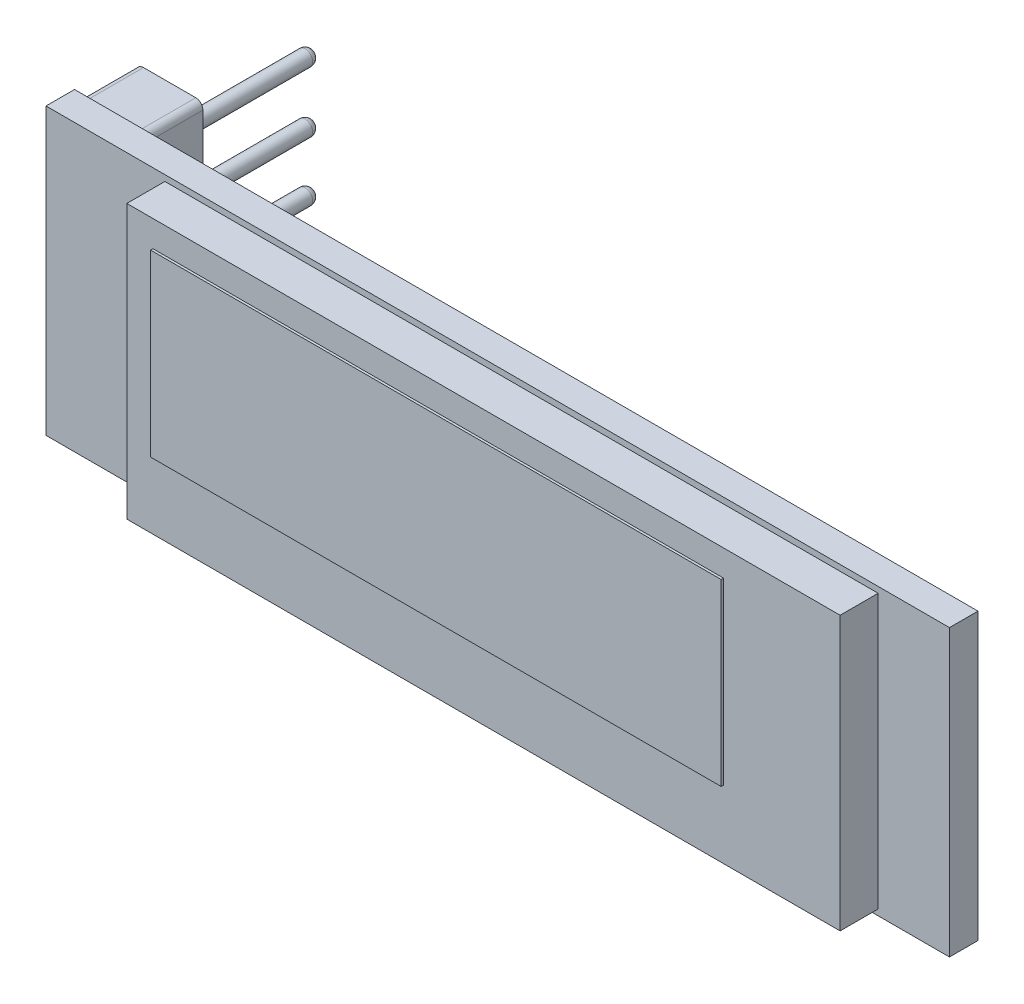
ISO-10303-21;
HEADER;
FILE_DESCRIPTION(('STEP AP214'),'2;1');
FILE_NAME('part.step','',(''),(''),'','','');
FILE_SCHEMA(('AUTOMOTIVE_DESIGN { 1 0 10303 214 1 1 1 1 }'));
ENDSEC;
DATA;
#1=APPLICATION_CONTEXT('core data for automotive mechanical design processes');
#2=APPLICATION_PROTOCOL_DEFINITION('international standard','automotive_design',2000,#1);
#3=PRODUCT_CONTEXT('',#1,'mechanical');
#4=PRODUCT('Part','Part','',(#3));
#5=PRODUCT_RELATED_PRODUCT_CATEGORY('part','',(#4));
#6=PRODUCT_DEFINITION_FORMATION('','',#4);
#7=PRODUCT_DEFINITION_CONTEXT('part definition',#1,'design');
#8=PRODUCT_DEFINITION('design','',#6,#7);
#9=PRODUCT_DEFINITION_SHAPE('','',#8);
#10=(LENGTH_UNIT() NAMED_UNIT(*) SI_UNIT(.MILLI.,.METRE.));
#11=(NAMED_UNIT(*) PLANE_ANGLE_UNIT() SI_UNIT($,.RADIAN.));
#12=(NAMED_UNIT(*) SI_UNIT($,.STERADIAN.) SOLID_ANGLE_UNIT());
#13=UNCERTAINTY_MEASURE_WITH_UNIT(LENGTH_MEASURE(1.E-05),#10,'distance_accuracy_value','');
#14=(GEOMETRIC_REPRESENTATION_CONTEXT(3) GLOBAL_UNCERTAINTY_ASSIGNED_CONTEXT((#13)) GLOBAL_UNIT_ASSIGNED_CONTEXT((#10,
#11,#12)) REPRESENTATION_CONTEXT('',''));
#15=CARTESIAN_POINT('',(0.,0.,0.));
#16=DIRECTION('',(0.,0.,1.));
#17=DIRECTION('',(1.,0.,0.));
#18=AXIS2_PLACEMENT_3D('',#15,#16,#17);
#19=CARTESIAN_POINT('',(0.,0.,2.8));
#20=DIRECTION('',(0.,0.,-1.));
#21=DIRECTION('',(-1.,0.,0.));
#22=AXIS2_PLACEMENT_3D('',#19,#20,#21);
#23=PLANE('',#22);
#24=DIRECTION('',(0.,1.,0.));
#25=VECTOR('',#24,1.);
#26=CARTESIAN_POINT('',(16.,-5.75,2.8));
#27=LINE('',#26,#25);
#28=CARTESIAN_POINT('',(16.,-5.75,2.8));
#29=VERTEX_POINT('',#28);
#30=CARTESIAN_POINT('',(16.,5.75,2.8));
#31=VERTEX_POINT('',#30);
#32=EDGE_CURVE('E227',#29,#31,#27,.T.);
#33=ORIENTED_EDGE('',*,*,#32,.T.);
#34=DIRECTION('',(-1.,0.,0.));
#35=VECTOR('',#34,1.);
#36=CARTESIAN_POINT('',(-14.,5.75,2.8));
#37=LINE('',#36,#35);
#38=CARTESIAN_POINT('',(-14.,5.75,2.8));
#39=VERTEX_POINT('',#38);
#40=EDGE_CURVE('E230',#31,#39,#37,.T.);
#41=ORIENTED_EDGE('',*,*,#40,.T.);
#42=DIRECTION('',(0.,-1.,0.));
#43=VECTOR('',#42,1.);
#44=CARTESIAN_POINT('',(-14.,-5.75,2.8));
#45=LINE('',#44,#43);
#46=CARTESIAN_POINT('',(-14.,-5.75,2.8));
#47=VERTEX_POINT('',#46);
#48=EDGE_CURVE('E233',#39,#47,#45,.T.);
#49=ORIENTED_EDGE('',*,*,#48,.T.);
#50=DIRECTION('',(1.,0.,0.));
#51=VECTOR('',#50,1.);
#52=CARTESIAN_POINT('',(-14.,-5.75,2.8));
#53=LINE('',#52,#51);
#54=EDGE_CURVE('E235',#47,#29,#53,.T.);
#55=ORIENTED_EDGE('',*,*,#54,.T.);
#56=EDGE_LOOP('',(#33,#41,#49,#55));
#57=FACE_BOUND('',#56,.T.);
#58=DIRECTION('',(0.,1.,0.));
#59=VECTOR('',#58,1.);
#60=CARTESIAN_POINT('',(11.1,4.65,2.8));
#61=LINE('',#60,#59);
#62=CARTESIAN_POINT('',(11.1,-2.89,2.8));
#63=VERTEX_POINT('',#62);
#64=CARTESIAN_POINT('',(11.1,4.65,2.8));
#65=VERTEX_POINT('',#64);
#66=EDGE_CURVE('E51',#63,#65,#61,.T.);
#67=ORIENTED_EDGE('',*,*,#66,.F.);
#68=DIRECTION('',(1.,0.,0.));
#69=VECTOR('',#68,1.);
#70=CARTESIAN_POINT('',(-12.9,-2.89,2.8));
#71=LINE('',#70,#69);
#72=CARTESIAN_POINT('',(-12.9,-2.89,2.8));
#73=VERTEX_POINT('',#72);
#74=EDGE_CURVE('E55',#73,#63,#71,.T.);
#75=ORIENTED_EDGE('',*,*,#74,.F.);
#76=DIRECTION('',(0.,-1.,0.));
#77=VECTOR('',#76,1.);
#78=CARTESIAN_POINT('',(-12.9,4.65,2.8));
#79=LINE('',#78,#77);
#80=CARTESIAN_POINT('',(-12.9,4.65,2.8));
#81=VERTEX_POINT('',#80);
#82=EDGE_CURVE('E736',#81,#73,#79,.T.);
#83=ORIENTED_EDGE('',*,*,#82,.F.);
#84=DIRECTION('',(-1.,0.,0.));
#85=VECTOR('',#84,1.);
#86=CARTESIAN_POINT('',(-12.9,4.65,2.8));
#87=LINE('',#86,#85);
#88=EDGE_CURVE('E742',#65,#81,#87,.T.);
#89=ORIENTED_EDGE('',*,*,#88,.F.);
#90=EDGE_LOOP('',(#67,#75,#83,#89));
#91=FACE_BOUND('',#90,.T.);
#92=ADVANCED_FACE('F36',(#57,#91),#23,.F.);
#93=CARTESIAN_POINT('',(0.,0.,0.));
#94=DIRECTION('',(0.,0.,1.));
#95=DIRECTION('',(1.,0.,0.));
#96=AXIS2_PLACEMENT_3D('',#93,#94,#95);
#97=PLANE('',#96);
#98=DIRECTION('',(0.,-1.,0.));
#99=VECTOR('',#98,1.);
#100=CARTESIAN_POINT('',(-19.,-6.,0.));
#101=LINE('',#100,#99);
#102=CARTESIAN_POINT('',(-19.,6.,0.));
#103=VERTEX_POINT('',#102);
#104=CARTESIAN_POINT('',(-19.,-6.,0.));
#105=VERTEX_POINT('',#104);
#106=EDGE_CURVE('E259',#103,#105,#101,.T.);
#107=ORIENTED_EDGE('',*,*,#106,.F.);
#108=DIRECTION('',(-1.,0.,0.));
#109=VECTOR('',#108,1.);
#110=CARTESIAN_POINT('',(19.,6.,0.));
#111=LINE('',#110,#109);
#112=CARTESIAN_POINT('',(19.,6.,0.));
#113=VERTEX_POINT('',#112);
#114=EDGE_CURVE('E264',#113,#103,#111,.T.);
#115=ORIENTED_EDGE('',*,*,#114,.F.);
#116=DIRECTION('',(0.,1.,0.));
#117=VECTOR('',#116,1.);
#118=CARTESIAN_POINT('',(19.,-6.,0.));
#119=LINE('',#118,#117);
#120=CARTESIAN_POINT('',(19.,-6.,0.));
#121=VERTEX_POINT('',#120);
#122=EDGE_CURVE('E275',#121,#113,#119,.T.);
#123=ORIENTED_EDGE('',*,*,#122,.F.);
#124=DIRECTION('',(1.,0.,0.));
#125=VECTOR('',#124,1.);
#126=CARTESIAN_POINT('',(19.,-6.,0.));
#127=LINE('',#126,#125);
#128=EDGE_CURVE('E273',#105,#121,#127,.T.);
#129=ORIENTED_EDGE('',*,*,#128,.F.);
#130=EDGE_LOOP('',(#107,#115,#123,#129));
#131=FACE_BOUND('',#130,.T.);
#132=DIRECTION('',(0.,-1.,0.));
#133=VECTOR('',#132,1.);
#134=CARTESIAN_POINT('',(-16.1,-5.75,0.));
#135=LINE('',#134,#133);
#136=CARTESIAN_POINT('',(-16.1,5.45,0.));
#137=VERTEX_POINT('',#136);
#138=CARTESIAN_POINT('',(-16.1,-5.45,0.));
#139=VERTEX_POINT('',#138);
#140=EDGE_CURVE('E215',#137,#139,#135,.T.);
#141=ORIENTED_EDGE('',*,*,#140,.F.);
#142=CARTESIAN_POINT('',(-16.4,5.45,0.));
#143=DIRECTION('',(0.,0.,1.));
#144=DIRECTION('',(1.,0.,0.));
#145=AXIS2_PLACEMENT_3D('',#142,#143,#144);
#146=CIRCLE('',#145,0.3);
#147=CARTESIAN_POINT('',(-16.4,5.75,0.));
#148=VERTEX_POINT('',#147);
#149=EDGE_CURVE('E348',#137,#148,#146,.T.);
#150=ORIENTED_EDGE('',*,*,#149,.T.);
#151=DIRECTION('',(1.,0.,0.));
#152=VECTOR('',#151,1.);
#153=CARTESIAN_POINT('',(-18.9,5.75,0.));
#154=LINE('',#153,#152);
#155=CARTESIAN_POINT('',(-18.6,5.75,0.));
#156=VERTEX_POINT('',#155);
#157=EDGE_CURVE('E205',#156,#148,#154,.T.);
#158=ORIENTED_EDGE('',*,*,#157,.F.);
#159=CARTESIAN_POINT('',(-18.6,5.45,0.));
#160=DIRECTION('',(0.,0.,1.));
#161=DIRECTION('',(1.,0.,0.));
#162=AXIS2_PLACEMENT_3D('',#159,#160,#161);
#163=CIRCLE('',#162,0.3);
#164=CARTESIAN_POINT('',(-18.9,5.45,0.));
#165=VERTEX_POINT('',#164);
#166=EDGE_CURVE('E350',#156,#165,#163,.T.);
#167=ORIENTED_EDGE('',*,*,#166,.T.);
#168=DIRECTION('',(0.,1.,0.));
#169=VECTOR('',#168,1.);
#170=CARTESIAN_POINT('',(-18.9,-5.75,0.));
#171=LINE('',#170,#169);
#172=CARTESIAN_POINT('',(-18.9,-5.45,0.));
#173=VERTEX_POINT('',#172);
#174=EDGE_CURVE('E222',#173,#165,#171,.T.);
#175=ORIENTED_EDGE('',*,*,#174,.F.);
#176=CARTESIAN_POINT('',(-18.6,-5.45,0.));
#177=DIRECTION('',(0.,0.,1.));
#178=DIRECTION('',(1.,0.,0.));
#179=AXIS2_PLACEMENT_3D('',#176,#177,#178);
#180=CIRCLE('',#179,0.3);
#181=CARTESIAN_POINT('',(-18.6,-5.75,0.));
#182=VERTEX_POINT('',#181);
#183=EDGE_CURVE('E11',#173,#182,#180,.T.);
#184=ORIENTED_EDGE('',*,*,#183,.T.);
#185=DIRECTION('',(-1.,0.,0.));
#186=VECTOR('',#185,1.);
#187=CARTESIAN_POINT('',(-18.9,-5.75,0.));
#188=LINE('',#187,#186);
#189=CARTESIAN_POINT('',(-16.4,-5.75,0.));
#190=VERTEX_POINT('',#189);
#191=EDGE_CURVE('E218',#190,#182,#188,.T.);
#192=ORIENTED_EDGE('',*,*,#191,.F.);
#193=CARTESIAN_POINT('',(-16.4,-5.45,0.));
#194=DIRECTION('',(0.,0.,1.));
#195=DIRECTION('',(1.,0.,0.));
#196=AXIS2_PLACEMENT_3D('',#193,#194,#195);
#197=CIRCLE('',#196,0.3);
#198=EDGE_CURVE('E44',#190,#139,#197,.T.);
#199=ORIENTED_EDGE('',*,*,#198,.T.);
#200=EDGE_LOOP('',(#141,#150,#158,#167,#175,#184,#192,#199));
#201=FACE_BOUND('',#200,.T.);
#202=ADVANCED_FACE('F354',(#131,#201),#97,.F.);
#203=CARTESIAN_POINT('',(-19.,-6.,1.2));
#204=DIRECTION('',(1.,0.,0.));
#205=DIRECTION('',(0.,0.,-1.));
#206=AXIS2_PLACEMENT_3D('',#203,#204,#205);
#207=PLANE('',#206);
#208=ORIENTED_EDGE('',*,*,#106,.T.);
#209=DIRECTION('',(0.,0.,-1.));
#210=VECTOR('',#209,1.);
#211=CARTESIAN_POINT('',(-19.,-6.,1.2));
#212=LINE('',#211,#210);
#213=CARTESIAN_POINT('',(-19.,-6.,1.2));
#214=VERTEX_POINT('',#213);
#215=EDGE_CURVE('E286',#214,#105,#212,.T.);
#216=ORIENTED_EDGE('',*,*,#215,.F.);
#217=DIRECTION('',(0.,-1.,0.));
#218=VECTOR('',#217,1.);
#219=CARTESIAN_POINT('',(-19.,-6.,1.2));
#220=LINE('',#219,#218);
#221=CARTESIAN_POINT('',(-19.,6.,1.2));
#222=VERTEX_POINT('',#221);
#223=EDGE_CURVE('E260',#222,#214,#220,.T.);
#224=ORIENTED_EDGE('',*,*,#223,.F.);
#225=DIRECTION('',(0.,0.,-1.));
#226=VECTOR('',#225,1.);
#227=CARTESIAN_POINT('',(-19.,6.,1.2));
#228=LINE('',#227,#226);
#229=EDGE_CURVE('E270',#222,#103,#228,.T.);
#230=ORIENTED_EDGE('',*,*,#229,.T.);
#231=EDGE_LOOP('',(#208,#216,#224,#230));
#232=FACE_BOUND('',#231,.T.);
#233=ADVANCED_FACE('F407',(#232),#207,.F.);
#234=CARTESIAN_POINT('',(19.,-6.,1.2));
#235=DIRECTION('',(0.,1.,0.));
#236=DIRECTION('',(-1.,0.,0.));
#237=AXIS2_PLACEMENT_3D('',#234,#235,#236);
#238=PLANE('',#237);
#239=ORIENTED_EDGE('',*,*,#128,.T.);
#240=DIRECTION('',(0.,0.,-1.));
#241=VECTOR('',#240,1.);
#242=CARTESIAN_POINT('',(19.,-6.,1.2));
#243=LINE('',#242,#241);
#244=CARTESIAN_POINT('',(19.,-6.,1.2));
#245=VERTEX_POINT('',#244);
#246=EDGE_CURVE('E283',#245,#121,#243,.T.);
#247=ORIENTED_EDGE('',*,*,#246,.F.);
#248=DIRECTION('',(1.,0.,0.));
#249=VECTOR('',#248,1.);
#250=CARTESIAN_POINT('',(19.,-6.,1.2));
#251=LINE('',#250,#249);
#252=EDGE_CURVE('E263',#214,#245,#251,.T.);
#253=ORIENTED_EDGE('',*,*,#252,.F.);
#254=ORIENTED_EDGE('',*,*,#215,.T.);
#255=EDGE_LOOP('',(#239,#247,#253,#254));
#256=FACE_BOUND('',#255,.T.);
#257=ADVANCED_FACE('F440',(#256),#238,.F.);
#258=CARTESIAN_POINT('',(19.,-6.,1.2));
#259=DIRECTION('',(-1.,0.,0.));
#260=DIRECTION('',(0.,0.,1.));
#261=AXIS2_PLACEMENT_3D('',#258,#259,#260);
#262=PLANE('',#261);
#263=ORIENTED_EDGE('',*,*,#122,.T.);
#264=DIRECTION('',(0.,0.,-1.));
#265=VECTOR('',#264,1.);
#266=CARTESIAN_POINT('',(19.,6.,1.2));
#267=LINE('',#266,#265);
#268=CARTESIAN_POINT('',(19.,6.,1.2));
#269=VERTEX_POINT('',#268);
#270=EDGE_CURVE('E280',#269,#113,#267,.T.);
#271=ORIENTED_EDGE('',*,*,#270,.F.);
#272=DIRECTION('',(0.,1.,0.));
#273=VECTOR('',#272,1.);
#274=CARTESIAN_POINT('',(19.,-6.,1.2));
#275=LINE('',#274,#273);
#276=EDGE_CURVE('E266',#245,#269,#275,.T.);
#277=ORIENTED_EDGE('',*,*,#276,.F.);
#278=ORIENTED_EDGE('',*,*,#246,.T.);
#279=EDGE_LOOP('',(#263,#271,#277,#278));
#280=FACE_BOUND('',#279,.T.);
#281=ADVANCED_FACE('F436',(#280),#262,.F.);
#282=CARTESIAN_POINT('',(19.,6.,1.2));
#283=DIRECTION('',(0.,-1.,0.));
#284=DIRECTION('',(1.,0.,0.));
#285=AXIS2_PLACEMENT_3D('',#282,#283,#284);
#286=PLANE('',#285);
#287=ORIENTED_EDGE('',*,*,#114,.T.);
#288=ORIENTED_EDGE('',*,*,#229,.F.);
#289=DIRECTION('',(-1.,0.,0.));
#290=VECTOR('',#289,1.);
#291=CARTESIAN_POINT('',(19.,6.,1.2));
#292=LINE('',#291,#290);
#293=EDGE_CURVE('E268',#269,#222,#292,.T.);
#294=ORIENTED_EDGE('',*,*,#293,.F.);
#295=ORIENTED_EDGE('',*,*,#270,.T.);
#296=EDGE_LOOP('',(#287,#288,#294,#295));
#297=FACE_BOUND('',#296,.T.);
#298=ADVANCED_FACE('F431',(#297),#286,.F.);
#299=CARTESIAN_POINT('',(0.,0.,1.2));
#300=DIRECTION('',(0.,0.,1.));
#301=DIRECTION('',(1.,0.,0.));
#302=AXIS2_PLACEMENT_3D('',#299,#300,#301);
#303=PLANE('',#302);
#304=DIRECTION('',(0.,1.,0.));
#305=VECTOR('',#304,1.);
#306=CARTESIAN_POINT('',(16.,-5.75,1.2));
#307=LINE('',#306,#305);
#308=CARTESIAN_POINT('',(16.,-5.75,1.2));
#309=VERTEX_POINT('',#308);
#310=CARTESIAN_POINT('',(16.,5.75,1.2));
#311=VERTEX_POINT('',#310);
#312=EDGE_CURVE('E214',#309,#311,#307,.T.);
#313=ORIENTED_EDGE('',*,*,#312,.F.);
#314=DIRECTION('',(1.,0.,0.));
#315=VECTOR('',#314,1.);
#316=CARTESIAN_POINT('',(-14.,-5.75,1.2));
#317=LINE('',#316,#315);
#318=CARTESIAN_POINT('',(-14.,-5.75,1.2));
#319=VERTEX_POINT('',#318);
#320=EDGE_CURVE('E231',#319,#309,#317,.T.);
#321=ORIENTED_EDGE('',*,*,#320,.F.);
#322=DIRECTION('',(0.,-1.,0.));
#323=VECTOR('',#322,1.);
#324=CARTESIAN_POINT('',(-14.,-5.75,1.2));
#325=LINE('',#324,#323);
#326=CARTESIAN_POINT('',(-14.,5.75,1.2));
#327=VERTEX_POINT('',#326);
#328=EDGE_CURVE('E243',#327,#319,#325,.T.);
#329=ORIENTED_EDGE('',*,*,#328,.F.);
#330=DIRECTION('',(-1.,0.,0.));
#331=VECTOR('',#330,1.);
#332=CARTESIAN_POINT('',(-14.,5.75,1.2));
#333=LINE('',#332,#331);
#334=EDGE_CURVE('E240',#311,#327,#333,.T.);
#335=ORIENTED_EDGE('',*,*,#334,.F.);
#336=EDGE_LOOP('',(#313,#321,#329,#335));
#337=FACE_BOUND('',#336,.T.);
#338=ORIENTED_EDGE('',*,*,#223,.T.);
#339=ORIENTED_EDGE('',*,*,#252,.T.);
#340=ORIENTED_EDGE('',*,*,#276,.T.);
#341=ORIENTED_EDGE('',*,*,#293,.T.);
#342=EDGE_LOOP('',(#338,#339,#340,#341));
#343=FACE_BOUND('',#342,.T.);
#344=ADVANCED_FACE('F428',(#337,#343),#303,.T.);
#345=CARTESIAN_POINT('',(16.,-5.75,2.8));
#346=DIRECTION('',(-1.,0.,0.));
#347=DIRECTION('',(0.,0.,1.));
#348=AXIS2_PLACEMENT_3D('',#345,#346,#347);
#349=PLANE('',#348);
#350=ORIENTED_EDGE('',*,*,#312,.T.);
#351=DIRECTION('',(0.,0.,-1.));
#352=VECTOR('',#351,1.);
#353=CARTESIAN_POINT('',(16.,5.75,2.8));
#354=LINE('',#353,#352);
#355=EDGE_CURVE('E256',#31,#311,#354,.T.);
#356=ORIENTED_EDGE('',*,*,#355,.F.);
#357=ORIENTED_EDGE('',*,*,#32,.F.);
#358=DIRECTION('',(0.,0.,-1.));
#359=VECTOR('',#358,1.);
#360=CARTESIAN_POINT('',(16.,-5.75,2.8));
#361=LINE('',#360,#359);
#362=EDGE_CURVE('E237',#29,#309,#361,.T.);
#363=ORIENTED_EDGE('',*,*,#362,.T.);
#364=EDGE_LOOP('',(#350,#356,#357,#363));
#365=FACE_BOUND('',#364,.T.);
#366=ADVANCED_FACE('F424',(#365),#349,.F.);
#367=CARTESIAN_POINT('',(-14.,5.75,2.8));
#368=DIRECTION('',(0.,-1.,0.));
#369=DIRECTION('',(0.,0.,-1.));
#370=AXIS2_PLACEMENT_3D('',#367,#368,#369);
#371=PLANE('',#370);
#372=ORIENTED_EDGE('',*,*,#334,.T.);
#373=DIRECTION('',(0.,0.,-1.));
#374=VECTOR('',#373,1.);
#375=CARTESIAN_POINT('',(-14.,5.75,2.8));
#376=LINE('',#375,#374);
#377=EDGE_CURVE('E253',#39,#327,#376,.T.);
#378=ORIENTED_EDGE('',*,*,#377,.F.);
#379=ORIENTED_EDGE('',*,*,#40,.F.);
#380=ORIENTED_EDGE('',*,*,#355,.T.);
#381=EDGE_LOOP('',(#372,#378,#379,#380));
#382=FACE_BOUND('',#381,.T.);
#383=ADVANCED_FACE('F420',(#382),#371,.F.);
#384=CARTESIAN_POINT('',(-14.,-5.75,2.8));
#385=DIRECTION('',(1.,0.,0.));
#386=DIRECTION('',(0.,0.,-1.));
#387=AXIS2_PLACEMENT_3D('',#384,#385,#386);
#388=PLANE('',#387);
#389=ORIENTED_EDGE('',*,*,#328,.T.);
#390=DIRECTION('',(0.,0.,-1.));
#391=VECTOR('',#390,1.);
#392=CARTESIAN_POINT('',(-14.,-5.75,2.8));
#393=LINE('',#392,#391);
#394=EDGE_CURVE('E250',#47,#319,#393,.T.);
#395=ORIENTED_EDGE('',*,*,#394,.F.);
#396=ORIENTED_EDGE('',*,*,#48,.F.);
#397=ORIENTED_EDGE('',*,*,#377,.T.);
#398=EDGE_LOOP('',(#389,#395,#396,#397));
#399=FACE_BOUND('',#398,.T.);
#400=ADVANCED_FACE('F416',(#399),#388,.F.);
#401=CARTESIAN_POINT('',(-14.,-5.75,2.8));
#402=DIRECTION('',(0.,1.,0.));
#403=DIRECTION('',(0.,0.,1.));
#404=AXIS2_PLACEMENT_3D('',#401,#402,#403);
#405=PLANE('',#404);
#406=ORIENTED_EDGE('',*,*,#320,.T.);
#407=ORIENTED_EDGE('',*,*,#362,.F.);
#408=ORIENTED_EDGE('',*,*,#54,.F.);
#409=ORIENTED_EDGE('',*,*,#394,.T.);
#410=EDGE_LOOP('',(#406,#407,#408,#409));
#411=FACE_BOUND('',#410,.T.);
#412=ADVANCED_FACE('F413',(#411),#405,.F.);
#413=CARTESIAN_POINT('',(-16.1,-5.75,-2.5));
#414=DIRECTION('',(-1.,0.,0.));
#415=DIRECTION('',(0.,0.,1.));
#416=AXIS2_PLACEMENT_3D('',#413,#414,#415);
#417=PLANE('',#416);
#418=DIRECTION('',(0.,-1.,0.));
#419=VECTOR('',#418,1.);
#420=CARTESIAN_POINT('',(-16.1,-5.75,-2.5));
#421=LINE('',#420,#419);
#422=CARTESIAN_POINT('',(-16.1,5.45,-2.5));
#423=VERTEX_POINT('',#422);
#424=CARTESIAN_POINT('',(-16.1,-5.45,-2.5));
#425=VERTEX_POINT('',#424);
#426=EDGE_CURVE('E201',#423,#425,#421,.T.);
#427=ORIENTED_EDGE('',*,*,#426,.F.);
#428=DIRECTION('',(0.,0.,1.));
#429=VECTOR('',#428,1.);
#430=CARTESIAN_POINT('',(-16.1,5.45,-2.5));
#431=LINE('',#430,#429);
#432=EDGE_CURVE('E322',#423,#137,#431,.T.);
#433=ORIENTED_EDGE('',*,*,#432,.T.);
#434=ORIENTED_EDGE('',*,*,#140,.T.);
#435=DIRECTION('',(0.,0.,1.));
#436=VECTOR('',#435,1.);
#437=CARTESIAN_POINT('',(-16.1,-5.45,-2.5));
#438=LINE('',#437,#436);
#439=EDGE_CURVE('E320',#139,#425,#438,.F.);
#440=ORIENTED_EDGE('',*,*,#439,.T.);
#441=EDGE_LOOP('',(#427,#433,#434,#440));
#442=FACE_BOUND('',#441,.T.);
#443=ADVANCED_FACE('F360',(#442),#417,.F.);
#444=CARTESIAN_POINT('',(-18.9,-5.75,-2.5));
#445=DIRECTION('',(0.,1.,0.));
#446=DIRECTION('',(0.,0.,1.));
#447=AXIS2_PLACEMENT_3D('',#444,#445,#446);
#448=PLANE('',#447);
#449=DIRECTION('',(-1.,0.,0.));
#450=VECTOR('',#449,1.);
#451=CARTESIAN_POINT('',(-18.9,-5.75,-2.5));
#452=LINE('',#451,#450);
#453=CARTESIAN_POINT('',(-16.4,-5.75,-2.5));
#454=VERTEX_POINT('',#453);
#455=CARTESIAN_POINT('',(-18.6,-5.75,-2.5));
#456=VERTEX_POINT('',#455);
#457=EDGE_CURVE('E204',#454,#456,#452,.T.);
#458=ORIENTED_EDGE('',*,*,#457,.F.);
#459=DIRECTION('',(0.,0.,1.));
#460=VECTOR('',#459,1.);
#461=CARTESIAN_POINT('',(-16.4,-5.75,-2.5));
#462=LINE('',#461,#460);
#463=EDGE_CURVE('E345',#454,#190,#462,.T.);
#464=ORIENTED_EDGE('',*,*,#463,.T.);
#465=ORIENTED_EDGE('',*,*,#191,.T.);
#466=DIRECTION('',(0.,0.,1.));
#467=VECTOR('',#466,1.);
#468=CARTESIAN_POINT('',(-18.6,-5.75,-2.5));
#469=LINE('',#468,#467);
#470=EDGE_CURVE('E343',#182,#456,#469,.F.);
#471=ORIENTED_EDGE('',*,*,#470,.T.);
#472=EDGE_LOOP('',(#458,#464,#465,#471));
#473=FACE_BOUND('',#472,.T.);
#474=ADVANCED_FACE('F369',(#473),#448,.F.);
#475=CARTESIAN_POINT('',(-18.9,-5.75,-2.5));
#476=DIRECTION('',(1.,0.,0.));
#477=DIRECTION('',(0.,0.,-1.));
#478=AXIS2_PLACEMENT_3D('',#475,#476,#477);
#479=PLANE('',#478);
#480=ORIENTED_EDGE('',*,*,#174,.T.);
#481=DIRECTION('',(0.,0.,1.));
#482=VECTOR('',#481,1.);
#483=CARTESIAN_POINT('',(-18.9,5.45,-2.5));
#484=LINE('',#483,#482);
#485=CARTESIAN_POINT('',(-18.9,5.45,-2.5));
#486=VERTEX_POINT('',#485);
#487=EDGE_CURVE('E341',#165,#486,#484,.F.);
#488=ORIENTED_EDGE('',*,*,#487,.T.);
#489=DIRECTION('',(0.,1.,0.));
#490=VECTOR('',#489,1.);
#491=CARTESIAN_POINT('',(-18.9,-5.75,-2.5));
#492=LINE('',#491,#490);
#493=CARTESIAN_POINT('',(-18.9,-5.45,-2.5));
#494=VERTEX_POINT('',#493);
#495=EDGE_CURVE('E208',#494,#486,#492,.T.);
#496=ORIENTED_EDGE('',*,*,#495,.F.);
#497=DIRECTION('',(0.,0.,1.));
#498=VECTOR('',#497,1.);
#499=CARTESIAN_POINT('',(-18.9,-5.45,-2.5));
#500=LINE('',#499,#498);
#501=EDGE_CURVE('E338',#494,#173,#500,.T.);
#502=ORIENTED_EDGE('',*,*,#501,.T.);
#503=EDGE_LOOP('',(#480,#488,#496,#502));
#504=FACE_BOUND('',#503,.T.);
#505=ADVANCED_FACE('F376',(#504),#479,.F.);
#506=CARTESIAN_POINT('',(-18.9,5.75,-2.5));
#507=DIRECTION('',(0.,-1.,0.));
#508=DIRECTION('',(0.,0.,-1.));
#509=AXIS2_PLACEMENT_3D('',#506,#507,#508);
#510=PLANE('',#509);
#511=ORIENTED_EDGE('',*,*,#157,.T.);
#512=DIRECTION('',(0.,0.,1.));
#513=VECTOR('',#512,1.);
#514=CARTESIAN_POINT('',(-16.4,5.75,-2.5));
#515=LINE('',#514,#513);
#516=CARTESIAN_POINT('',(-16.4,5.75,-2.5));
#517=VERTEX_POINT('',#516);
#518=EDGE_CURVE('E328',#148,#517,#515,.F.);
#519=ORIENTED_EDGE('',*,*,#518,.T.);
#520=DIRECTION('',(1.,0.,0.));
#521=VECTOR('',#520,1.);
#522=CARTESIAN_POINT('',(-18.9,5.75,-2.5));
#523=LINE('',#522,#521);
#524=CARTESIAN_POINT('',(-18.6,5.75,-2.5));
#525=VERTEX_POINT('',#524);
#526=EDGE_CURVE('E211',#525,#517,#523,.T.);
#527=ORIENTED_EDGE('',*,*,#526,.F.);
#528=DIRECTION('',(0.,0.,1.));
#529=VECTOR('',#528,1.);
#530=CARTESIAN_POINT('',(-18.6,5.75,-2.5));
#531=LINE('',#530,#529);
#532=EDGE_CURVE('E325',#525,#156,#531,.T.);
#533=ORIENTED_EDGE('',*,*,#532,.T.);
#534=EDGE_LOOP('',(#511,#519,#527,#533));
#535=FACE_BOUND('',#534,.T.);
#536=ADVANCED_FACE('F385',(#535),#510,.F.);
#537=CARTESIAN_POINT('',(0.,0.,-2.5));
#538=DIRECTION('',(0.,0.,-1.));
#539=DIRECTION('',(-1.,0.,0.));
#540=AXIS2_PLACEMENT_3D('',#537,#538,#539);
#541=PLANE('',#540);
#542=CARTESIAN_POINT('',(-17.5,-3.81,-2.5));
#543=DIRECTION('',(0.,0.,-1.));
#544=DIRECTION('',(-1.,0.,0.));
#545=AXIS2_PLACEMENT_3D('',#542,#543,#544);
#546=CIRCLE('',#545,0.32);
#547=CARTESIAN_POINT('',(-17.82,-3.81,-2.5));
#548=VERTEX_POINT('',#547);
#549=EDGE_CURVE('E192',#548,#548,#546,.F.);
#550=ORIENTED_EDGE('',*,*,#549,.T.);
#551=EDGE_LOOP('',(#550));
#552=FACE_BOUND('',#551,.T.);
#553=CARTESIAN_POINT('',(-17.5,-1.25,-2.5));
#554=DIRECTION('',(0.,0.,-1.));
#555=DIRECTION('',(-1.,0.,0.));
#556=AXIS2_PLACEMENT_3D('',#553,#554,#555);
#557=CIRCLE('',#556,0.32);
#558=CARTESIAN_POINT('',(-17.82,-1.25,-2.5));
#559=VERTEX_POINT('',#558);
#560=EDGE_CURVE('E195',#559,#559,#557,.F.);
#561=ORIENTED_EDGE('',*,*,#560,.T.);
#562=EDGE_LOOP('',(#561));
#563=FACE_BOUND('',#562,.T.);
#564=CARTESIAN_POINT('',(-17.5,1.25,-2.5));
#565=DIRECTION('',(0.,0.,-1.));
#566=DIRECTION('',(-1.,0.,0.));
#567=AXIS2_PLACEMENT_3D('',#564,#565,#566);
#568=CIRCLE('',#567,0.32);
#569=CARTESIAN_POINT('',(-17.82,1.25,-2.5));
#570=VERTEX_POINT('',#569);
#571=EDGE_CURVE('E292',#570,#570,#568,.F.);
#572=ORIENTED_EDGE('',*,*,#571,.T.);
#573=EDGE_LOOP('',(#572));
#574=FACE_BOUND('',#573,.T.);
#575=CARTESIAN_POINT('',(-17.5,3.81,-2.5));
#576=DIRECTION('',(0.,0.,-1.));
#577=DIRECTION('',(-1.,0.,0.));
#578=AXIS2_PLACEMENT_3D('',#575,#576,#577);
#579=CIRCLE('',#578,0.32);
#580=CARTESIAN_POINT('',(-17.82,3.81,-2.5));
#581=VERTEX_POINT('',#580);
#582=EDGE_CURVE('E219',#581,#581,#579,.F.);
#583=ORIENTED_EDGE('',*,*,#582,.T.);
#584=EDGE_LOOP('',(#583));
#585=FACE_BOUND('',#584,.T.);
#586=ORIENTED_EDGE('',*,*,#526,.T.);
#587=CARTESIAN_POINT('',(-16.4,5.45,-2.5));
#588=DIRECTION('',(0.,0.,-1.));
#589=DIRECTION('',(-1.,0.,0.));
#590=AXIS2_PLACEMENT_3D('',#587,#588,#589);
#591=CIRCLE('',#590,0.3);
#592=EDGE_CURVE('E336',#517,#423,#591,.T.);
#593=ORIENTED_EDGE('',*,*,#592,.T.);
#594=ORIENTED_EDGE('',*,*,#426,.T.);
#595=CARTESIAN_POINT('',(-16.4,-5.45,-2.5));
#596=DIRECTION('',(0.,0.,-1.));
#597=DIRECTION('',(-1.,0.,0.));
#598=AXIS2_PLACEMENT_3D('',#595,#596,#597);
#599=CIRCLE('',#598,0.3);
#600=EDGE_CURVE('E332',#425,#454,#599,.T.);
#601=ORIENTED_EDGE('',*,*,#600,.T.);
#602=ORIENTED_EDGE('',*,*,#457,.T.);
#603=CARTESIAN_POINT('',(-18.6,-5.45,-2.5));
#604=DIRECTION('',(0.,0.,-1.));
#605=DIRECTION('',(-1.,0.,0.));
#606=AXIS2_PLACEMENT_3D('',#603,#604,#605);
#607=CIRCLE('',#606,0.3);
#608=EDGE_CURVE('E330',#456,#494,#607,.T.);
#609=ORIENTED_EDGE('',*,*,#608,.T.);
#610=ORIENTED_EDGE('',*,*,#495,.T.);
#611=CARTESIAN_POINT('',(-18.6,5.45,-2.5));
#612=DIRECTION('',(0.,0.,-1.));
#613=DIRECTION('',(-1.,0.,0.));
#614=AXIS2_PLACEMENT_3D('',#611,#612,#613);
#615=CIRCLE('',#614,0.3);
#616=EDGE_CURVE('E334',#486,#525,#615,.T.);
#617=ORIENTED_EDGE('',*,*,#616,.T.);
#618=EDGE_LOOP('',(#586,#593,#594,#601,#602,#609,#610,#617));
#619=FACE_BOUND('',#618,.T.);
#620=ADVANCED_FACE('F366',(#552,#563,#574,#585,#619),#541,.T.);
#621=CARTESIAN_POINT('',(-17.5,3.81,-8.5));
#622=DIRECTION('',(0.,0.,1.));
#623=DIRECTION('',(1.,0.,0.));
#624=AXIS2_PLACEMENT_3D('',#621,#622,#623);
#625=CYLINDRICAL_SURFACE('',#624,0.32);
#626=CARTESIAN_POINT('',(-17.5,3.81,-8.2));
#627=DIRECTION('',(0.,0.,-1.));
#628=DIRECTION('',(-1.,0.,0.));
#629=AXIS2_PLACEMENT_3D('',#626,#627,#628);
#630=CIRCLE('',#629,0.32);
#631=CARTESIAN_POINT('',(-17.82,3.81,-8.2));
#632=VERTEX_POINT('',#631);
#633=EDGE_CURVE('E317',#632,#632,#630,.F.);
#634=ORIENTED_EDGE('',*,*,#633,.T.);
#635=EDGE_LOOP('',(#634));
#636=FACE_BOUND('',#635,.T.);
#637=ORIENTED_EDGE('',*,*,#582,.F.);
#638=EDGE_LOOP('',(#637));
#639=FACE_BOUND('',#638,.T.);
#640=ADVANCED_FACE('F484',(#636,#639),#625,.T.);
#641=CARTESIAN_POINT('',(-17.5,3.81,-8.5));
#642=DIRECTION('',(0.,0.,-1.));
#643=DIRECTION('',(-1.,0.,0.));
#644=AXIS2_PLACEMENT_3D('',#641,#642,#643);
#645=PLANE('',#644);
#646=CARTESIAN_POINT('',(-17.5,3.81,-8.5));
#647=DIRECTION('',(0.,0.,-1.));
#648=DIRECTION('',(-1.,0.,0.));
#649=AXIS2_PLACEMENT_3D('',#646,#647,#648);
#650=CIRCLE('',#649,0.0200000000000004);
#651=CARTESIAN_POINT('',(-17.52,3.81,-8.5));
#652=VERTEX_POINT('',#651);
#653=EDGE_CURVE('E314',#652,#652,#650,.T.);
#654=ORIENTED_EDGE('',*,*,#653,.T.);
#655=EDGE_LOOP('',(#654));
#656=FACE_BOUND('',#655,.T.);
#657=ADVANCED_FACE('F477',(#656),#645,.T.);
#658=CARTESIAN_POINT('',(-17.5,1.25,-8.5));
#659=DIRECTION('',(0.,0.,1.));
#660=DIRECTION('',(1.,0.,0.));
#661=AXIS2_PLACEMENT_3D('',#658,#659,#660);
#662=CYLINDRICAL_SURFACE('',#661,0.32);
#663=CARTESIAN_POINT('',(-17.5,1.25,-8.2));
#664=DIRECTION('',(0.,0.,-1.));
#665=DIRECTION('',(-1.,0.,0.));
#666=AXIS2_PLACEMENT_3D('',#663,#664,#665);
#667=CIRCLE('',#666,0.32);
#668=CARTESIAN_POINT('',(-17.82,1.25,-8.2));
#669=VERTEX_POINT('',#668);
#670=EDGE_CURVE('E311',#669,#669,#667,.F.);
#671=ORIENTED_EDGE('',*,*,#670,.T.);
#672=EDGE_LOOP('',(#671));
#673=FACE_BOUND('',#672,.T.);
#674=ORIENTED_EDGE('',*,*,#571,.F.);
#675=EDGE_LOOP('',(#674));
#676=FACE_BOUND('',#675,.T.);
#677=ADVANCED_FACE('F468',(#673,#676),#662,.T.);
#678=CARTESIAN_POINT('',(-17.5,1.25,-8.5));
#679=DIRECTION('',(0.,0.,-1.));
#680=DIRECTION('',(-1.,0.,0.));
#681=AXIS2_PLACEMENT_3D('',#678,#679,#680);
#682=PLANE('',#681);
#683=CARTESIAN_POINT('',(-17.5,1.25,-8.5));
#684=DIRECTION('',(0.,0.,-1.));
#685=DIRECTION('',(-1.,0.,0.));
#686=AXIS2_PLACEMENT_3D('',#683,#684,#685);
#687=CIRCLE('',#686,0.0200000000000004);
#688=CARTESIAN_POINT('',(-17.52,1.25,-8.5));
#689=VERTEX_POINT('',#688);
#690=EDGE_CURVE('E308',#689,#689,#687,.T.);
#691=ORIENTED_EDGE('',*,*,#690,.T.);
#692=EDGE_LOOP('',(#691));
#693=FACE_BOUND('',#692,.T.);
#694=ADVANCED_FACE('F465',(#693),#682,.T.);
#695=CARTESIAN_POINT('',(-17.5,-1.25,-8.5));
#696=DIRECTION('',(0.,0.,1.));
#697=DIRECTION('',(1.,0.,0.));
#698=AXIS2_PLACEMENT_3D('',#695,#696,#697);
#699=CYLINDRICAL_SURFACE('',#698,0.32);
#700=CARTESIAN_POINT('',(-17.5,-1.25,-8.2));
#701=DIRECTION('',(0.,0.,-1.));
#702=DIRECTION('',(-1.,0.,0.));
#703=AXIS2_PLACEMENT_3D('',#700,#701,#702);
#704=CIRCLE('',#703,0.32);
#705=CARTESIAN_POINT('',(-17.82,-1.25,-8.2));
#706=VERTEX_POINT('',#705);
#707=EDGE_CURVE('E305',#706,#706,#704,.F.);
#708=ORIENTED_EDGE('',*,*,#707,.T.);
#709=EDGE_LOOP('',(#708));
#710=FACE_BOUND('',#709,.T.);
#711=ORIENTED_EDGE('',*,*,#560,.F.);
#712=EDGE_LOOP('',(#711));
#713=FACE_BOUND('',#712,.T.);
#714=ADVANCED_FACE('F467',(#710,#713),#699,.T.);
#715=CARTESIAN_POINT('',(-17.5,-1.25,-8.5));
#716=DIRECTION('',(0.,0.,-1.));
#717=DIRECTION('',(-1.,0.,0.));
#718=AXIS2_PLACEMENT_3D('',#715,#716,#717);
#719=PLANE('',#718);
#720=CARTESIAN_POINT('',(-17.5,-1.25,-8.5));
#721=DIRECTION('',(0.,0.,-1.));
#722=DIRECTION('',(-1.,0.,0.));
#723=AXIS2_PLACEMENT_3D('',#720,#721,#722);
#724=CIRCLE('',#723,0.0200000000000004);
#725=CARTESIAN_POINT('',(-17.52,-1.25,-8.5));
#726=VERTEX_POINT('',#725);
#727=EDGE_CURVE('E302',#726,#726,#724,.T.);
#728=ORIENTED_EDGE('',*,*,#727,.T.);
#729=EDGE_LOOP('',(#728));
#730=FACE_BOUND('',#729,.T.);
#731=ADVANCED_FACE('F474',(#730),#719,.T.);
#732=CARTESIAN_POINT('',(-17.5,-3.81,-8.5));
#733=DIRECTION('',(0.,0.,1.));
#734=DIRECTION('',(1.,0.,0.));
#735=AXIS2_PLACEMENT_3D('',#732,#733,#734);
#736=CYLINDRICAL_SURFACE('',#735,0.32);
#737=CARTESIAN_POINT('',(-17.5,-3.81,-8.2));
#738=DIRECTION('',(0.,0.,-1.));
#739=DIRECTION('',(-1.,0.,0.));
#740=AXIS2_PLACEMENT_3D('',#737,#738,#739);
#741=CIRCLE('',#740,0.32);
#742=CARTESIAN_POINT('',(-17.82,-3.81,-8.2));
#743=VERTEX_POINT('',#742);
#744=EDGE_CURVE('E299',#743,#743,#741,.F.);
#745=ORIENTED_EDGE('',*,*,#744,.T.);
#746=EDGE_LOOP('',(#745));
#747=FACE_BOUND('',#746,.T.);
#748=ORIENTED_EDGE('',*,*,#549,.F.);
#749=EDGE_LOOP('',(#748));
#750=FACE_BOUND('',#749,.T.);
#751=ADVANCED_FACE('F574',(#747,#750),#736,.T.);
#752=CARTESIAN_POINT('',(-17.5,-3.81,-8.5));
#753=DIRECTION('',(0.,0.,-1.));
#754=DIRECTION('',(-1.,0.,0.));
#755=AXIS2_PLACEMENT_3D('',#752,#753,#754);
#756=PLANE('',#755);
#757=CARTESIAN_POINT('',(-17.5,-3.81,-8.5));
#758=DIRECTION('',(0.,0.,-1.));
#759=DIRECTION('',(-1.,0.,0.));
#760=AXIS2_PLACEMENT_3D('',#757,#758,#759);
#761=CIRCLE('',#760,0.0200000000000004);
#762=CARTESIAN_POINT('',(-17.52,-3.81,-8.5));
#763=VERTEX_POINT('',#762);
#764=EDGE_CURVE('E289',#763,#763,#761,.T.);
#765=ORIENTED_EDGE('',*,*,#764,.T.);
#766=EDGE_LOOP('',(#765));
#767=FACE_BOUND('',#766,.T.);
#768=ADVANCED_FACE('F452',(#767),#756,.T.);
#769=CARTESIAN_POINT('',(-17.5,-3.81,-8.2));
#770=DIRECTION('',(0.,0.,-1.));
#771=DIRECTION('',(-1.,0.,0.));
#772=AXIS2_PLACEMENT_3D('',#769,#770,#771);
#773=DEGENERATE_TOROIDAL_SURFACE('',#772,0.0200000000000004,0.3,.T.);
#774=ORIENTED_EDGE('',*,*,#744,.F.);
#775=EDGE_LOOP('',(#774));
#776=FACE_BOUND('',#775,.T.);
#777=ORIENTED_EDGE('',*,*,#764,.F.);
#778=EDGE_LOOP('',(#777));
#779=FACE_BOUND('',#778,.T.);
#780=ADVANCED_FACE('F448',(#776,#779),#773,.T.);
#781=CARTESIAN_POINT('',(-17.5,-1.25,-8.2));
#782=DIRECTION('',(0.,0.,-1.));
#783=DIRECTION('',(-1.,0.,0.));
#784=AXIS2_PLACEMENT_3D('',#781,#782,#783);
#785=DEGENERATE_TOROIDAL_SURFACE('',#784,0.0200000000000004,0.3,.T.);
#786=ORIENTED_EDGE('',*,*,#707,.F.);
#787=EDGE_LOOP('',(#786));
#788=FACE_BOUND('',#787,.T.);
#789=ORIENTED_EDGE('',*,*,#727,.F.);
#790=EDGE_LOOP('',(#789));
#791=FACE_BOUND('',#790,.T.);
#792=ADVANCED_FACE('F451',(#788,#791),#785,.T.);
#793=CARTESIAN_POINT('',(-17.5,1.25,-8.2));
#794=DIRECTION('',(0.,0.,-1.));
#795=DIRECTION('',(-1.,0.,0.));
#796=AXIS2_PLACEMENT_3D('',#793,#794,#795);
#797=DEGENERATE_TOROIDAL_SURFACE('',#796,0.0200000000000004,0.3,.T.);
#798=ORIENTED_EDGE('',*,*,#670,.F.);
#799=EDGE_LOOP('',(#798));
#800=FACE_BOUND('',#799,.T.);
#801=ORIENTED_EDGE('',*,*,#690,.F.);
#802=EDGE_LOOP('',(#801));
#803=FACE_BOUND('',#802,.T.);
#804=ADVANCED_FACE('F398',(#800,#803),#797,.T.);
#805=CARTESIAN_POINT('',(-17.5,3.81,-8.2));
#806=DIRECTION('',(0.,0.,-1.));
#807=DIRECTION('',(-1.,0.,0.));
#808=AXIS2_PLACEMENT_3D('',#805,#806,#807);
#809=DEGENERATE_TOROIDAL_SURFACE('',#808,0.0200000000000004,0.3,.T.);
#810=ORIENTED_EDGE('',*,*,#633,.F.);
#811=EDGE_LOOP('',(#810));
#812=FACE_BOUND('',#811,.T.);
#813=ORIENTED_EDGE('',*,*,#653,.F.);
#814=EDGE_LOOP('',(#813));
#815=FACE_BOUND('',#814,.T.);
#816=ADVANCED_FACE('F391',(#812,#815),#809,.T.);
#817=CARTESIAN_POINT('',(-16.4,5.45,-2.5));
#818=DIRECTION('',(0.,0.,1.));
#819=DIRECTION('',(1.,0.,0.));
#820=AXIS2_PLACEMENT_3D('',#817,#818,#819);
#821=CYLINDRICAL_SURFACE('',#820,0.3);
#822=ORIENTED_EDGE('',*,*,#592,.F.);
#823=ORIENTED_EDGE('',*,*,#518,.F.);
#824=ORIENTED_EDGE('',*,*,#149,.F.);
#825=ORIENTED_EDGE('',*,*,#432,.F.);
#826=EDGE_LOOP('',(#822,#823,#824,#825));
#827=FACE_BOUND('',#826,.T.);
#828=ADVANCED_FACE('F389',(#827),#821,.T.);
#829=CARTESIAN_POINT('',(-18.6,5.45,-2.5));
#830=DIRECTION('',(0.,0.,1.));
#831=DIRECTION('',(1.,0.,0.));
#832=AXIS2_PLACEMENT_3D('',#829,#830,#831);
#833=CYLINDRICAL_SURFACE('',#832,0.3);
#834=ORIENTED_EDGE('',*,*,#616,.F.);
#835=ORIENTED_EDGE('',*,*,#487,.F.);
#836=ORIENTED_EDGE('',*,*,#166,.F.);
#837=ORIENTED_EDGE('',*,*,#532,.F.);
#838=EDGE_LOOP('',(#834,#835,#836,#837));
#839=FACE_BOUND('',#838,.T.);
#840=ADVANCED_FACE('F380',(#839),#833,.T.);
#841=CARTESIAN_POINT('',(-16.4,-5.45,-2.5));
#842=DIRECTION('',(0.,0.,1.));
#843=DIRECTION('',(1.,0.,0.));
#844=AXIS2_PLACEMENT_3D('',#841,#842,#843);
#845=CYLINDRICAL_SURFACE('',#844,0.3);
#846=ORIENTED_EDGE('',*,*,#600,.F.);
#847=ORIENTED_EDGE('',*,*,#439,.F.);
#848=ORIENTED_EDGE('',*,*,#198,.F.);
#849=ORIENTED_EDGE('',*,*,#463,.F.);
#850=EDGE_LOOP('',(#846,#847,#848,#849));
#851=FACE_BOUND('',#850,.T.);
#852=ADVANCED_FACE('F363',(#851),#845,.T.);
#853=CARTESIAN_POINT('',(-18.6,-5.45,-2.5));
#854=DIRECTION('',(0.,0.,1.));
#855=DIRECTION('',(1.,0.,0.));
#856=AXIS2_PLACEMENT_3D('',#853,#854,#855);
#857=CYLINDRICAL_SURFACE('',#856,0.3);
#858=ORIENTED_EDGE('',*,*,#608,.F.);
#859=ORIENTED_EDGE('',*,*,#470,.F.);
#860=ORIENTED_EDGE('',*,*,#183,.F.);
#861=ORIENTED_EDGE('',*,*,#501,.F.);
#862=EDGE_LOOP('',(#858,#859,#860,#861));
#863=FACE_BOUND('',#862,.T.);
#864=ADVANCED_FACE('F38',(#863),#857,.T.);
#865=CARTESIAN_POINT('',(11.1,4.65,2.9));
#866=DIRECTION('',(-1.,0.,0.));
#867=DIRECTION('',(0.,-1.,0.));
#868=AXIS2_PLACEMENT_3D('',#865,#866,#867);
#869=PLANE('',#868);
#870=ORIENTED_EDGE('',*,*,#66,.T.);
#871=DIRECTION('',(0.,0.,-1.));
#872=VECTOR('',#871,1.);
#873=CARTESIAN_POINT('',(11.1,4.65,2.9));
#874=LINE('',#873,#872);
#875=CARTESIAN_POINT('',(11.1,4.65,2.9));
#876=VERTEX_POINT('',#875);
#877=EDGE_CURVE('E175',#876,#65,#874,.T.);
#878=ORIENTED_EDGE('',*,*,#877,.F.);
#879=DIRECTION('',(0.,1.,0.));
#880=VECTOR('',#879,1.);
#881=CARTESIAN_POINT('',(11.1,4.65,2.9));
#882=LINE('',#881,#880);
#883=CARTESIAN_POINT('',(11.1,-2.89,2.9));
#884=VERTEX_POINT('',#883);
#885=EDGE_CURVE('E181',#884,#876,#882,.T.);
#886=ORIENTED_EDGE('',*,*,#885,.F.);
#887=DIRECTION('',(0.,0.,-1.));
#888=VECTOR('',#887,1.);
#889=CARTESIAN_POINT('',(11.1,-2.89,2.9));
#890=LINE('',#889,#888);
#891=EDGE_CURVE('E734',#884,#63,#890,.T.);
#892=ORIENTED_EDGE('',*,*,#891,.T.);
#893=EDGE_LOOP('',(#870,#878,#886,#892));
#894=FACE_BOUND('',#893,.T.);
#895=ADVANCED_FACE('F191',(#894),#869,.F.);
#896=CARTESIAN_POINT('',(-12.9,4.65,2.9));
#897=DIRECTION('',(0.,-1.,0.));
#898=DIRECTION('',(0.,0.,-1.));
#899=AXIS2_PLACEMENT_3D('',#896,#897,#898);
#900=PLANE('',#899);
#901=ORIENTED_EDGE('',*,*,#88,.T.);
#902=DIRECTION('',(0.,0.,-1.));
#903=VECTOR('',#902,1.);
#904=CARTESIAN_POINT('',(-12.9,4.65,2.9));
#905=LINE('',#904,#903);
#906=CARTESIAN_POINT('',(-12.9,4.65,2.9));
#907=VERTEX_POINT('',#906);
#908=EDGE_CURVE('E177',#907,#81,#905,.T.);
#909=ORIENTED_EDGE('',*,*,#908,.F.);
#910=DIRECTION('',(-1.,0.,0.));
#911=VECTOR('',#910,1.);
#912=CARTESIAN_POINT('',(-12.9,4.65,2.9));
#913=LINE('',#912,#911);
#914=EDGE_CURVE('E170',#876,#907,#913,.T.);
#915=ORIENTED_EDGE('',*,*,#914,.F.);
#916=ORIENTED_EDGE('',*,*,#877,.T.);
#917=EDGE_LOOP('',(#901,#909,#915,#916));
#918=FACE_BOUND('',#917,.T.);
#919=ADVANCED_FACE('F173',(#918),#900,.F.);
#920=CARTESIAN_POINT('',(-12.9,4.65,2.9));
#921=DIRECTION('',(1.,0.,0.));
#922=DIRECTION('',(0.,0.,-1.));
#923=AXIS2_PLACEMENT_3D('',#920,#921,#922);
#924=PLANE('',#923);
#925=ORIENTED_EDGE('',*,*,#82,.T.);
#926=DIRECTION('',(0.,0.,-1.));
#927=VECTOR('',#926,1.);
#928=CARTESIAN_POINT('',(-12.9,-2.89,2.9));
#929=LINE('',#928,#927);
#930=CARTESIAN_POINT('',(-12.9,-2.89,2.9));
#931=VERTEX_POINT('',#930);
#932=EDGE_CURVE('E197',#931,#73,#929,.T.);
#933=ORIENTED_EDGE('',*,*,#932,.F.);
#934=DIRECTION('',(0.,-1.,0.));
#935=VECTOR('',#934,1.);
#936=CARTESIAN_POINT('',(-12.9,4.65,2.9));
#937=LINE('',#936,#935);
#938=EDGE_CURVE('E180',#907,#931,#937,.T.);
#939=ORIENTED_EDGE('',*,*,#938,.F.);
#940=ORIENTED_EDGE('',*,*,#908,.T.);
#941=EDGE_LOOP('',(#925,#933,#939,#940));
#942=FACE_BOUND('',#941,.T.);
#943=ADVANCED_FACE('F687',(#942),#924,.F.);
#944=CARTESIAN_POINT('',(-12.9,-2.89,2.9));
#945=DIRECTION('',(0.,1.,0.));
#946=DIRECTION('',(0.,0.,1.));
#947=AXIS2_PLACEMENT_3D('',#944,#945,#946);
#948=PLANE('',#947);
#949=ORIENTED_EDGE('',*,*,#74,.T.);
#950=ORIENTED_EDGE('',*,*,#891,.F.);
#951=DIRECTION('',(1.,0.,0.));
#952=VECTOR('',#951,1.);
#953=CARTESIAN_POINT('',(-12.9,-2.89,2.9));
#954=LINE('',#953,#952);
#955=EDGE_CURVE('E186',#931,#884,#954,.T.);
#956=ORIENTED_EDGE('',*,*,#955,.F.);
#957=ORIENTED_EDGE('',*,*,#932,.T.);
#958=EDGE_LOOP('',(#949,#950,#956,#957));
#959=FACE_BOUND('',#958,.T.);
#960=ADVANCED_FACE('F696',(#959),#948,.F.);
#961=CARTESIAN_POINT('',(0.,0.,2.9));
#962=DIRECTION('',(0.,0.,1.));
#963=DIRECTION('',(1.,0.,0.));
#964=AXIS2_PLACEMENT_3D('',#961,#962,#963);
#965=PLANE('',#964);
#966=ORIENTED_EDGE('',*,*,#885,.T.);
#967=ORIENTED_EDGE('',*,*,#914,.T.);
#968=ORIENTED_EDGE('',*,*,#938,.T.);
#969=ORIENTED_EDGE('',*,*,#955,.T.);
#970=EDGE_LOOP('',(#966,#967,#968,#969));
#971=FACE_BOUND('',#970,.T.);
#972=ADVANCED_FACE('F184',(#971),#965,.T.);
#973=CLOSED_SHELL('',(#92,#202,#233,#257,#281,#298,#344,#366,#383,#400,#412,#443,#474,#505,#536,
#620,#640,#657,#677,#694,#714,#731,#751,#768,#780,#792,#804,#816,#828,#840,#852,#864,#895,#919,
#943,#960,#972));
#974=MANIFOLD_SOLID_BREP('B2',#973);
#975=ADVANCED_BREP_SHAPE_REPRESENTATION('',(#18,#974),#14);
#976=SHAPE_DEFINITION_REPRESENTATION(#9,#975);
ENDSEC;
END-ISO-10303-21;
